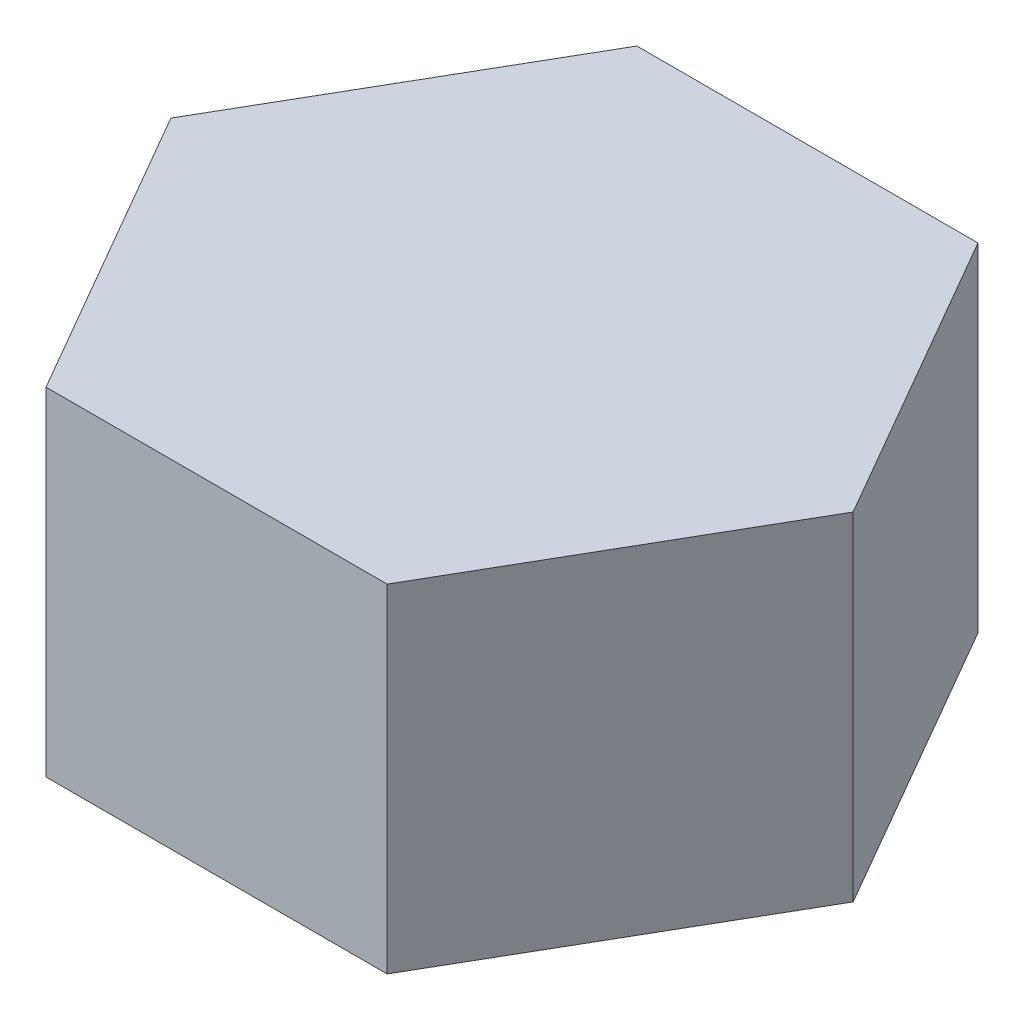
ISO-10303-21;
HEADER;
FILE_DESCRIPTION(('STEP AP214'),'2;1');
FILE_NAME('part.step','',(''),(''),'','','');
FILE_SCHEMA(('AUTOMOTIVE_DESIGN { 1 0 10303 214 1 1 1 1 }'));
ENDSEC;
DATA;
#1=APPLICATION_CONTEXT('core data for automotive mechanical design processes');
#2=APPLICATION_PROTOCOL_DEFINITION('international standard','automotive_design',2000,#1);
#3=PRODUCT_CONTEXT('',#1,'mechanical');
#4=PRODUCT('Part','Part','',(#3));
#5=PRODUCT_RELATED_PRODUCT_CATEGORY('part','',(#4));
#6=PRODUCT_DEFINITION_FORMATION('','',#4);
#7=PRODUCT_DEFINITION_CONTEXT('part definition',#1,'design');
#8=PRODUCT_DEFINITION('design','',#6,#7);
#9=PRODUCT_DEFINITION_SHAPE('','',#8);
#10=(LENGTH_UNIT() NAMED_UNIT(*) SI_UNIT(.MILLI.,.METRE.));
#11=(NAMED_UNIT(*) PLANE_ANGLE_UNIT() SI_UNIT($,.RADIAN.));
#12=(NAMED_UNIT(*) SI_UNIT($,.STERADIAN.) SOLID_ANGLE_UNIT());
#13=UNCERTAINTY_MEASURE_WITH_UNIT(LENGTH_MEASURE(1.E-05),#10,'distance_accuracy_value','');
#14=(GEOMETRIC_REPRESENTATION_CONTEXT(3) GLOBAL_UNCERTAINTY_ASSIGNED_CONTEXT((#13)) GLOBAL_UNIT_ASSIGNED_CONTEXT((#10,
#11,#12)) REPRESENTATION_CONTEXT('',''));
#15=CARTESIAN_POINT('',(0.,0.,0.));
#16=DIRECTION('',(0.,0.,1.));
#17=DIRECTION('',(1.,0.,0.));
#18=AXIS2_PLACEMENT_3D('',#15,#16,#17);
#19=CARTESIAN_POINT('',(0.,5.,0.));
#20=DIRECTION('',(0.,-1.,0.));
#21=DIRECTION('',(0.,0.,-1.));
#22=AXIS2_PLACEMENT_3D('',#19,#20,#21);
#23=PLANE('',#22);
#24=CARTESIAN_POINT('',(0.,5.,0.));
#25=DIRECTION('',(0.,-1.,0.));
#26=DIRECTION('',(0.,0.,-1.));
#27=AXIS2_PLACEMENT_3D('',#24,#25,#26);
#28=CIRCLE('',#27,2.);
#29=CARTESIAN_POINT('',(0.,5.,-2.));
#30=VERTEX_POINT('',#29);
#31=EDGE_CURVE('E19',#30,#30,#28,.T.);
#32=ORIENTED_EDGE('',*,*,#31,.T.);
#33=EDGE_LOOP('',(#32));
#34=FACE_BOUND('',#33,.T.);
#35=ADVANCED_FACE('F16',(#34),#23,.T.);
#36=CARTESIAN_POINT('',(0.,5.,0.));
#37=DIRECTION('',(0.,-1.,0.));
#38=DIRECTION('',(0.,0.,-1.));
#39=AXIS2_PLACEMENT_3D('',#36,#37,#38);
#40=CYLINDRICAL_SURFACE('',#39,2.);
#41=ORIENTED_EDGE('',*,*,#31,.F.);
#42=EDGE_LOOP('',(#41));
#43=FACE_BOUND('',#42,.T.);
#44=CARTESIAN_POINT('',(0.,0.,0.));
#45=DIRECTION('',(0.,-1.,0.));
#46=DIRECTION('',(0.,0.,-1.));
#47=AXIS2_PLACEMENT_3D('',#44,#45,#46);
#48=CIRCLE('',#47,2.);
#49=CARTESIAN_POINT('',(0.,0.,-2.));
#50=VERTEX_POINT('',#49);
#51=EDGE_CURVE('E80',#50,#50,#48,.T.);
#52=ORIENTED_EDGE('',*,*,#51,.T.);
#53=EDGE_LOOP('',(#52));
#54=FACE_BOUND('',#53,.T.);
#55=ADVANCED_FACE('F102',(#43,#54),#40,.F.);
#56=CARTESIAN_POINT('',(0.,0.,0.));
#57=DIRECTION('',(0.,1.,0.));
#58=DIRECTION('',(0.,0.,1.));
#59=AXIS2_PLACEMENT_3D('',#56,#57,#58);
#60=PLANE('',#59);
#61=DIRECTION('',(-0.499999999999998,0.,0.86602540378444));
#62=VECTOR('',#61,1.);
#63=CARTESIAN_POINT('',(3.20790243318487,0.,5.55625));
#64=LINE('',#63,#62);
#65=CARTESIAN_POINT('',(6.41580486636971,0.,0.));
#66=VERTEX_POINT('',#65);
#67=CARTESIAN_POINT('',(3.20790243318487,0.,5.55625));
#68=VERTEX_POINT('',#67);
#69=EDGE_CURVE('E254',#66,#68,#64,.T.);
#70=ORIENTED_EDGE('',*,*,#69,.T.);
#71=DIRECTION('',(-1.,0.,0.));
#72=VECTOR('',#71,1.);
#73=CARTESIAN_POINT('',(-3.20790243318487,0.,5.55625));
#74=LINE('',#73,#72);
#75=CARTESIAN_POINT('',(-3.20790243318487,0.,5.55625));
#76=VERTEX_POINT('',#75);
#77=EDGE_CURVE('E258',#68,#76,#74,.T.);
#78=ORIENTED_EDGE('',*,*,#77,.T.);
#79=DIRECTION('',(-0.499999999999998,0.,-0.86602540378444));
#80=VECTOR('',#79,1.);
#81=CARTESIAN_POINT('',(-3.20790243318487,0.,5.55625));
#82=LINE('',#81,#80);
#83=CARTESIAN_POINT('',(-6.41580486636971,0.,0.));
#84=VERTEX_POINT('',#83);
#85=EDGE_CURVE('E241',#76,#84,#82,.T.);
#86=ORIENTED_EDGE('',*,*,#85,.T.);
#87=DIRECTION('',(0.499999999999998,0.,-0.86602540378444));
#88=VECTOR('',#87,1.);
#89=CARTESIAN_POINT('',(-3.20790243318487,0.,-5.55625));
#90=LINE('',#89,#88);
#91=CARTESIAN_POINT('',(-3.20790243318487,0.,-5.55625));
#92=VERTEX_POINT('',#91);
#93=EDGE_CURVE('E85',#84,#92,#90,.T.);
#94=ORIENTED_EDGE('',*,*,#93,.T.);
#95=DIRECTION('',(1.,0.,0.));
#96=VECTOR('',#95,1.);
#97=CARTESIAN_POINT('',(-3.20790243318487,0.,-5.55625));
#98=LINE('',#97,#96);
#99=CARTESIAN_POINT('',(3.20790243318487,0.,-5.55625));
#100=VERTEX_POINT('',#99);
#101=EDGE_CURVE('E66',#92,#100,#98,.T.);
#102=ORIENTED_EDGE('',*,*,#101,.T.);
#103=DIRECTION('',(0.499999999999998,0.,0.86602540378444));
#104=VECTOR('',#103,1.);
#105=CARTESIAN_POINT('',(3.20790243318487,0.,-5.55625));
#106=LINE('',#105,#104);
#107=EDGE_CURVE('E71',#100,#66,#106,.T.);
#108=ORIENTED_EDGE('',*,*,#107,.T.);
#109=EDGE_LOOP('',(#70,#78,#86,#94,#102,#108));
#110=FACE_BOUND('',#109,.T.);
#111=ORIENTED_EDGE('',*,*,#51,.F.);
#112=EDGE_LOOP('',(#111));
#113=FACE_BOUND('',#112,.T.);
#114=ADVANCED_FACE('F82',(#110,#113),#60,.F.);
#115=CARTESIAN_POINT('',(3.20790243318487,6.35,-5.55625));
#116=DIRECTION('',(-0.86602540378444,0.,0.499999999999998));
#117=DIRECTION('',(0.499999999999998,0.,0.86602540378444));
#118=AXIS2_PLACEMENT_3D('',#115,#116,#117);
#119=PLANE('',#118);
#120=DIRECTION('',(0.,1.,0.));
#121=VECTOR('',#120,1.);
#122=CARTESIAN_POINT('',(3.20790243318487,6.35,-5.55625));
#123=LINE('',#122,#121);
#124=CARTESIAN_POINT('',(3.20790243318487,6.35,-5.55625));
#125=VERTEX_POINT('',#124);
#126=EDGE_CURVE('E73',#100,#125,#123,.T.);
#127=ORIENTED_EDGE('',*,*,#126,.T.);
#128=DIRECTION('',(-0.499999999999998,0.,-0.86602540378444));
#129=VECTOR('',#128,1.);
#130=CARTESIAN_POINT('',(6.41580486636971,6.35,0.));
#131=LINE('',#130,#129);
#132=CARTESIAN_POINT('',(6.41580486636971,6.35,0.));
#133=VERTEX_POINT('',#132);
#134=EDGE_CURVE('E249',#133,#125,#131,.T.);
#135=ORIENTED_EDGE('',*,*,#134,.F.);
#136=DIRECTION('',(0.,1.,0.));
#137=VECTOR('',#136,1.);
#138=CARTESIAN_POINT('',(6.41580486636971,6.35,0.));
#139=LINE('',#138,#137);
#140=EDGE_CURVE('E76',#133,#66,#139,.F.);
#141=ORIENTED_EDGE('',*,*,#140,.T.);
#142=ORIENTED_EDGE('',*,*,#107,.F.);
#143=EDGE_LOOP('',(#127,#135,#141,#142));
#144=FACE_BOUND('',#143,.T.);
#145=ADVANCED_FACE('F72',(#144),#119,.F.);
#146=CARTESIAN_POINT('',(-3.20790243318487,6.35,-5.55625));
#147=DIRECTION('',(0.,0.,1.));
#148=DIRECTION('',(1.,0.,0.));
#149=AXIS2_PLACEMENT_3D('',#146,#147,#148);
#150=PLANE('',#149);
#151=DIRECTION('',(0.,1.,0.));
#152=VECTOR('',#151,1.);
#153=CARTESIAN_POINT('',(-3.20790243318487,6.35,-5.55625));
#154=LINE('',#153,#152);
#155=CARTESIAN_POINT('',(-3.20790243318487,6.35,-5.55625));
#156=VERTEX_POINT('',#155);
#157=EDGE_CURVE('E87',#92,#156,#154,.T.);
#158=ORIENTED_EDGE('',*,*,#157,.T.);
#159=DIRECTION('',(1.,0.,0.));
#160=VECTOR('',#159,1.);
#161=CARTESIAN_POINT('',(0.,6.35,-5.55625));
#162=LINE('',#161,#160);
#163=EDGE_CURVE('E91',#125,#156,#162,.F.);
#164=ORIENTED_EDGE('',*,*,#163,.F.);
#165=ORIENTED_EDGE('',*,*,#126,.F.);
#166=ORIENTED_EDGE('',*,*,#101,.F.);
#167=EDGE_LOOP('',(#158,#164,#165,#166));
#168=FACE_BOUND('',#167,.T.);
#169=ADVANCED_FACE('F89',(#168),#150,.F.);
#170=CARTESIAN_POINT('',(-3.20790243318487,6.35,-5.55625));
#171=DIRECTION('',(0.86602540378444,0.,0.499999999999998));
#172=DIRECTION('',(0.499999999999998,0.,-0.86602540378444));
#173=AXIS2_PLACEMENT_3D('',#170,#171,#172);
#174=PLANE('',#173);
#175=DIRECTION('',(0.,1.,0.));
#176=VECTOR('',#175,1.);
#177=CARTESIAN_POINT('',(-6.41580486636971,6.35,0.));
#178=LINE('',#177,#176);
#179=CARTESIAN_POINT('',(-6.41580486636971,6.35,0.));
#180=VERTEX_POINT('',#179);
#181=EDGE_CURVE('E237',#84,#180,#178,.T.);
#182=ORIENTED_EDGE('',*,*,#181,.T.);
#183=DIRECTION('',(-0.499999999999998,0.,0.86602540378444));
#184=VECTOR('',#183,1.);
#185=CARTESIAN_POINT('',(-3.20790243318487,6.35,-5.55625));
#186=LINE('',#185,#184);
#187=EDGE_CURVE('E240',#156,#180,#186,.T.);
#188=ORIENTED_EDGE('',*,*,#187,.F.);
#189=ORIENTED_EDGE('',*,*,#157,.F.);
#190=ORIENTED_EDGE('',*,*,#93,.F.);
#191=EDGE_LOOP('',(#182,#188,#189,#190));
#192=FACE_BOUND('',#191,.T.);
#193=ADVANCED_FACE('F128',(#192),#174,.F.);
#194=CARTESIAN_POINT('',(-3.20790243318487,6.35,5.55625));
#195=DIRECTION('',(0.86602540378444,0.,-0.499999999999998));
#196=DIRECTION('',(-0.499999999999998,0.,-0.86602540378444));
#197=AXIS2_PLACEMENT_3D('',#194,#195,#196);
#198=PLANE('',#197);
#199=DIRECTION('',(0.,1.,0.));
#200=VECTOR('',#199,1.);
#201=CARTESIAN_POINT('',(-3.20790243318487,6.35,5.55625));
#202=LINE('',#201,#200);
#203=CARTESIAN_POINT('',(-3.20790243318487,6.35,5.55625));
#204=VERTEX_POINT('',#203);
#205=EDGE_CURVE('E246',#76,#204,#202,.T.);
#206=ORIENTED_EDGE('',*,*,#205,.T.);
#207=DIRECTION('',(0.499999999999998,0.,0.86602540378444));
#208=VECTOR('',#207,1.);
#209=CARTESIAN_POINT('',(-6.41580486636971,6.35,0.));
#210=LINE('',#209,#208);
#211=EDGE_CURVE('E244',#180,#204,#210,.T.);
#212=ORIENTED_EDGE('',*,*,#211,.F.);
#213=ORIENTED_EDGE('',*,*,#181,.F.);
#214=ORIENTED_EDGE('',*,*,#85,.F.);
#215=EDGE_LOOP('',(#206,#212,#213,#214));
#216=FACE_BOUND('',#215,.T.);
#217=ADVANCED_FACE('F125',(#216),#198,.F.);
#218=CARTESIAN_POINT('',(-3.20790243318487,6.35,5.55625));
#219=DIRECTION('',(0.,0.,-1.));
#220=DIRECTION('',(-1.,0.,0.));
#221=AXIS2_PLACEMENT_3D('',#218,#219,#220);
#222=PLANE('',#221);
#223=DIRECTION('',(0.,1.,0.));
#224=VECTOR('',#223,1.);
#225=CARTESIAN_POINT('',(3.20790243318487,6.35,5.55625));
#226=LINE('',#225,#224);
#227=CARTESIAN_POINT('',(3.20790243318487,6.35,5.55625));
#228=VERTEX_POINT('',#227);
#229=EDGE_CURVE('E34',#68,#228,#226,.T.);
#230=ORIENTED_EDGE('',*,*,#229,.T.);
#231=DIRECTION('',(1.,0.,0.));
#232=VECTOR('',#231,1.);
#233=CARTESIAN_POINT('',(0.,6.35,5.55625));
#234=LINE('',#233,#232);
#235=EDGE_CURVE('E25',#204,#228,#234,.T.);
#236=ORIENTED_EDGE('',*,*,#235,.F.);
#237=ORIENTED_EDGE('',*,*,#205,.F.);
#238=ORIENTED_EDGE('',*,*,#77,.F.);
#239=EDGE_LOOP('',(#230,#236,#237,#238));
#240=FACE_BOUND('',#239,.T.);
#241=ADVANCED_FACE('F118',(#240),#222,.F.);
#242=CARTESIAN_POINT('',(3.20790243318487,6.35,5.55625));
#243=DIRECTION('',(-0.86602540378444,0.,-0.499999999999998));
#244=DIRECTION('',(-0.499999999999998,0.,0.86602540378444));
#245=AXIS2_PLACEMENT_3D('',#242,#243,#244);
#246=PLANE('',#245);
#247=ORIENTED_EDGE('',*,*,#140,.F.);
#248=DIRECTION('',(0.499999999999998,0.,-0.86602540378444));
#249=VECTOR('',#248,1.);
#250=CARTESIAN_POINT('',(3.20790243318487,6.35,5.55625));
#251=LINE('',#250,#249);
#252=EDGE_CURVE('E11',#228,#133,#251,.T.);
#253=ORIENTED_EDGE('',*,*,#252,.F.);
#254=ORIENTED_EDGE('',*,*,#229,.F.);
#255=ORIENTED_EDGE('',*,*,#69,.F.);
#256=EDGE_LOOP('',(#247,#253,#254,#255));
#257=FACE_BOUND('',#256,.T.);
#258=ADVANCED_FACE('F112',(#257),#246,.F.);
#259=CARTESIAN_POINT('',(0.,6.35,0.));
#260=DIRECTION('',(0.,1.,0.));
#261=DIRECTION('',(0.,0.,1.));
#262=AXIS2_PLACEMENT_3D('',#259,#260,#261);
#263=PLANE('',#262);
#264=ORIENTED_EDGE('',*,*,#235,.T.);
#265=ORIENTED_EDGE('',*,*,#252,.T.);
#266=ORIENTED_EDGE('',*,*,#134,.T.);
#267=ORIENTED_EDGE('',*,*,#163,.T.);
#268=ORIENTED_EDGE('',*,*,#187,.T.);
#269=ORIENTED_EDGE('',*,*,#211,.T.);
#270=EDGE_LOOP('',(#264,#265,#266,#267,#268,#269));
#271=FACE_BOUND('',#270,.T.);
#272=ADVANCED_FACE('F110',(#271),#263,.T.);
#273=CLOSED_SHELL('',(#35,#55,#114,#145,#169,#193,#217,#241,#258,#272));
#274=MANIFOLD_SOLID_BREP('B1',#273);
#275=ADVANCED_BREP_SHAPE_REPRESENTATION('',(#18,#274),#14);
#276=SHAPE_DEFINITION_REPRESENTATION(#9,#275);
ENDSEC;
END-ISO-10303-21;
